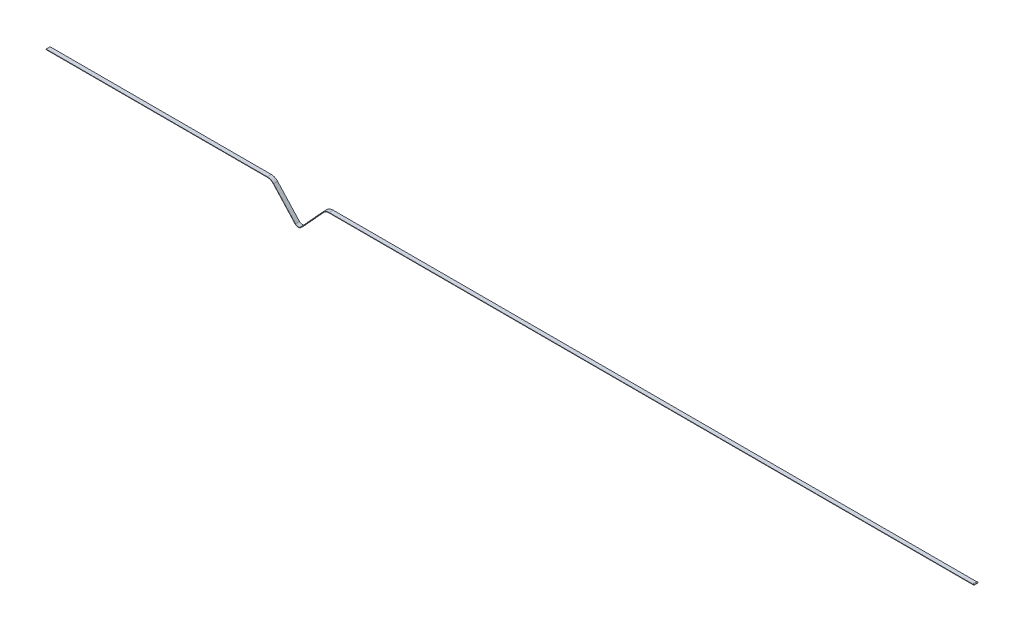
ISO-10303-21;
HEADER;
FILE_DESCRIPTION(('STEP AP214'),'2;1');
FILE_NAME('part.step','',(''),(''),'','','');
FILE_SCHEMA(('AUTOMOTIVE_DESIGN { 1 0 10303 214 1 1 1 1 }'));
ENDSEC;
DATA;
#1=APPLICATION_CONTEXT('core data for automotive mechanical design processes');
#2=APPLICATION_PROTOCOL_DEFINITION('international standard','automotive_design',2000,#1);
#3=PRODUCT_CONTEXT('',#1,'mechanical');
#4=PRODUCT('Part','Part','',(#3));
#5=PRODUCT_RELATED_PRODUCT_CATEGORY('part','',(#4));
#6=PRODUCT_DEFINITION_FORMATION('','',#4);
#7=PRODUCT_DEFINITION_CONTEXT('part definition',#1,'design');
#8=PRODUCT_DEFINITION('design','',#6,#7);
#9=PRODUCT_DEFINITION_SHAPE('','',#8);
#10=(LENGTH_UNIT() NAMED_UNIT(*) SI_UNIT(.MILLI.,.METRE.));
#11=(NAMED_UNIT(*) PLANE_ANGLE_UNIT() SI_UNIT($,.RADIAN.));
#12=(NAMED_UNIT(*) SI_UNIT($,.STERADIAN.) SOLID_ANGLE_UNIT());
#13=UNCERTAINTY_MEASURE_WITH_UNIT(LENGTH_MEASURE(1.E-05),#10,'distance_accuracy_value','');
#14=(GEOMETRIC_REPRESENTATION_CONTEXT(3) GLOBAL_UNCERTAINTY_ASSIGNED_CONTEXT((#13)) GLOBAL_UNIT_ASSIGNED_CONTEXT((#10,
#11,#12)) REPRESENTATION_CONTEXT('',''));
#15=CARTESIAN_POINT('',(0.,0.,0.));
#16=DIRECTION('',(0.,0.,1.));
#17=DIRECTION('',(1.,0.,0.));
#18=AXIS2_PLACEMENT_3D('',#15,#16,#17);
#19=CARTESIAN_POINT('',(0.,0.,0.));
#20=DIRECTION('',(-1.,0.,0.));
#21=DIRECTION('',(0.,0.,1.));
#22=AXIS2_PLACEMENT_3D('',#19,#20,#21);
#23=PLANE('',#22);
#24=DIRECTION('',(0.,-1.,0.));
#25=VECTOR('',#24,1.);
#26=CARTESIAN_POINT('',(0.,0.,0.));
#27=LINE('',#26,#25);
#28=CARTESIAN_POINT('',(0.,0.63,0.));
#29=VERTEX_POINT('',#28);
#30=CARTESIAN_POINT('',(0.,0.,0.));
#31=VERTEX_POINT('',#30);
#32=EDGE_CURVE('E247',#29,#31,#27,.T.);
#33=ORIENTED_EDGE('',*,*,#32,.T.);
#34=DIRECTION('',(0.,0.,-1.));
#35=VECTOR('',#34,1.);
#36=CARTESIAN_POINT('',(0.,0.,0.));
#37=LINE('',#36,#35);
#38=CARTESIAN_POINT('',(0.,0.,-6.));
#39=VERTEX_POINT('',#38);
#40=EDGE_CURVE('E181',#31,#39,#37,.T.);
#41=ORIENTED_EDGE('',*,*,#40,.T.);
#42=DIRECTION('',(0.,1.,0.));
#43=VECTOR('',#42,1.);
#44=CARTESIAN_POINT('',(0.,0.,-6.));
#45=LINE('',#44,#43);
#46=CARTESIAN_POINT('',(0.,0.63,-6.));
#47=VERTEX_POINT('',#46);
#48=EDGE_CURVE('E167',#39,#47,#45,.T.);
#49=ORIENTED_EDGE('',*,*,#48,.T.);
#50=DIRECTION('',(0.,0.,1.));
#51=VECTOR('',#50,1.);
#52=CARTESIAN_POINT('',(0.,0.63,0.));
#53=LINE('',#52,#51);
#54=EDGE_CURVE('E156',#47,#29,#53,.T.);
#55=ORIENTED_EDGE('',*,*,#54,.T.);
#56=EDGE_LOOP('',(#33,#41,#49,#55));
#57=FACE_BOUND('',#56,.T.);
#58=ADVANCED_FACE('F33',(#57),#23,.F.);
#59=CARTESIAN_POINT('',(-1371.6,0.,0.));
#60=DIRECTION('',(-1.,0.,0.));
#61=DIRECTION('',(0.,0.,1.));
#62=AXIS2_PLACEMENT_3D('',#59,#60,#61);
#63=PLANE('',#62);
#64=DIRECTION('',(0.,-1.,0.));
#65=VECTOR('',#64,1.);
#66=CARTESIAN_POINT('',(-1371.6,0.,0.));
#67=LINE('',#66,#65);
#68=CARTESIAN_POINT('',(-1371.6,0.629999999999958,0.));
#69=VERTEX_POINT('',#68);
#70=CARTESIAN_POINT('',(-1371.6,0.,0.));
#71=VERTEX_POINT('',#70);
#72=EDGE_CURVE('E55',#69,#71,#67,.T.);
#73=ORIENTED_EDGE('',*,*,#72,.F.);
#74=DIRECTION('',(0.,0.,1.));
#75=VECTOR('',#74,1.);
#76=CARTESIAN_POINT('',(-1371.6,0.629999999999958,0.));
#77=LINE('',#76,#75);
#78=CARTESIAN_POINT('',(-1371.6,0.629999999999958,-6.));
#79=VERTEX_POINT('',#78);
#80=EDGE_CURVE('E243',#79,#69,#77,.T.);
#81=ORIENTED_EDGE('',*,*,#80,.F.);
#82=DIRECTION('',(0.,1.,0.));
#83=VECTOR('',#82,1.);
#84=CARTESIAN_POINT('',(-1371.6,0.,-6.));
#85=LINE('',#84,#83);
#86=CARTESIAN_POINT('',(-1371.6,0.,-6.));
#87=VERTEX_POINT('',#86);
#88=EDGE_CURVE('E237',#87,#79,#85,.T.);
#89=ORIENTED_EDGE('',*,*,#88,.F.);
#90=DIRECTION('',(0.,0.,-1.));
#91=VECTOR('',#90,1.);
#92=CARTESIAN_POINT('',(-1371.6,0.,0.));
#93=LINE('',#92,#91);
#94=EDGE_CURVE('E11',#71,#87,#93,.T.);
#95=ORIENTED_EDGE('',*,*,#94,.F.);
#96=EDGE_LOOP('',(#73,#81,#89,#95));
#97=FACE_BOUND('',#96,.T.);
#98=ADVANCED_FACE('F367',(#97),#63,.T.);
#99=CARTESIAN_POINT('',(0.,0.,-6.));
#100=DIRECTION('',(0.,0.,1.));
#101=DIRECTION('',(1.,0.,0.));
#102=AXIS2_PLACEMENT_3D('',#99,#100,#101);
#103=PLANE('',#102);
#104=DIRECTION('',(-1.,0.,0.));
#105=VECTOR('',#104,1.);
#106=CARTESIAN_POINT('',(0.,0.63,-6.));
#107=LINE('',#106,#105);
#108=CARTESIAN_POINT('',(-1.5,0.63,-6.));
#109=VERTEX_POINT('',#108);
#110=CARTESIAN_POINT('',(-953.345987996192,0.629999999999884,-6.));
#111=VERTEX_POINT('',#110);
#112=EDGE_CURVE('E164',#109,#111,#107,.T.);
#113=ORIENTED_EDGE('',*,*,#112,.F.);
#114=CARTESIAN_POINT('',(-0.75,0.63,-6.));
#115=DIRECTION('',(0.,0.,1.));
#116=DIRECTION('',(1.,0.,0.));
#117=AXIS2_PLACEMENT_3D('',#114,#115,#116);
#118=CIRCLE('',#117,0.75);
#119=EDGE_CURVE('E150',#47,#109,#118,.T.);
#120=ORIENTED_EDGE('',*,*,#119,.F.);
#121=ORIENTED_EDGE('',*,*,#48,.F.);
#122=DIRECTION('',(-1.,0.,0.));
#123=VECTOR('',#122,1.);
#124=CARTESIAN_POINT('',(0.,0.,-6.));
#125=LINE('',#124,#123);
#126=CARTESIAN_POINT('',(-953.345987996192,-1.16226472890446E-13,-6.));
#127=VERTEX_POINT('',#126);
#128=EDGE_CURVE('E176',#39,#127,#125,.T.);
#129=ORIENTED_EDGE('',*,*,#128,.T.);
#130=DIRECTION('',(0.,1.,0.));
#131=VECTOR('',#130,1.);
#132=CARTESIAN_POINT('',(-953.345987996192,-1.16226472890446E-13,-6.));
#133=LINE('',#132,#131);
#134=EDGE_CURVE('E172',#127,#111,#133,.T.);
#135=ORIENTED_EDGE('',*,*,#134,.T.);
#136=EDGE_LOOP('',(#113,#120,#121,#129,#135));
#137=FACE_BOUND('',#136,.T.);
#138=ADVANCED_FACE('F170',(#137),#103,.F.);
#139=CARTESIAN_POINT('',(0.,0.63,0.));
#140=DIRECTION('',(0.,-1.,0.));
#141=DIRECTION('',(1.,0.,0.));
#142=AXIS2_PLACEMENT_3D('',#139,#140,#141);
#143=PLANE('',#142);
#144=DIRECTION('',(-1.,0.,0.));
#145=VECTOR('',#144,1.);
#146=CARTESIAN_POINT('',(0.,0.63,0.));
#147=LINE('',#146,#145);
#148=CARTESIAN_POINT('',(-1.5,0.63,0.));
#149=VERTEX_POINT('',#148);
#150=CARTESIAN_POINT('',(-953.345987996192,0.629999999999884,0.));
#151=VERTEX_POINT('',#150);
#152=EDGE_CURVE('E166',#149,#151,#147,.T.);
#153=ORIENTED_EDGE('',*,*,#152,.F.);
#154=DIRECTION('',(0.,0.,1.));
#155=VECTOR('',#154,1.);
#156=CARTESIAN_POINT('',(-1.5,0.63,-6.));
#157=LINE('',#156,#155);
#158=EDGE_CURVE('E153',#109,#149,#157,.T.);
#159=ORIENTED_EDGE('',*,*,#158,.F.);
#160=ORIENTED_EDGE('',*,*,#112,.T.);
#161=DIRECTION('',(0.,0.,1.));
#162=VECTOR('',#161,1.);
#163=CARTESIAN_POINT('',(-953.345987996192,0.629999999999884,0.));
#164=LINE('',#163,#162);
#165=EDGE_CURVE('E173',#111,#151,#164,.T.);
#166=ORIENTED_EDGE('',*,*,#165,.T.);
#167=EDGE_LOOP('',(#153,#159,#160,#166));
#168=FACE_BOUND('',#167,.T.);
#169=ADVANCED_FACE('F162',(#168),#143,.F.);
#170=CARTESIAN_POINT('',(0.,0.,0.));
#171=DIRECTION('',(0.,0.,-1.));
#172=DIRECTION('',(-1.,0.,0.));
#173=AXIS2_PLACEMENT_3D('',#170,#171,#172);
#174=PLANE('',#173);
#175=DIRECTION('',(0.,-1.,0.));
#176=VECTOR('',#175,1.);
#177=CARTESIAN_POINT('',(-953.345987996192,-1.16226472890446E-13,0.));
#178=LINE('',#177,#176);
#179=CARTESIAN_POINT('',(-953.345987996192,-1.16226472890446E-13,0.));
#180=VERTEX_POINT('',#179);
#181=EDGE_CURVE('E250',#151,#180,#178,.T.);
#182=ORIENTED_EDGE('',*,*,#181,.T.);
#183=DIRECTION('',(-1.,0.,0.));
#184=VECTOR('',#183,1.);
#185=CARTESIAN_POINT('',(0.,0.,0.));
#186=LINE('',#185,#184);
#187=EDGE_CURVE('E288',#31,#180,#186,.T.);
#188=ORIENTED_EDGE('',*,*,#187,.F.);
#189=ORIENTED_EDGE('',*,*,#32,.F.);
#190=CARTESIAN_POINT('',(-0.75,0.63,0.));
#191=DIRECTION('',(0.,0.,1.));
#192=DIRECTION('',(1.,0.,0.));
#193=AXIS2_PLACEMENT_3D('',#190,#191,#192);
#194=CIRCLE('',#193,0.75);
#195=EDGE_CURVE('E47',#29,#149,#194,.T.);
#196=ORIENTED_EDGE('',*,*,#195,.T.);
#197=ORIENTED_EDGE('',*,*,#152,.T.);
#198=EDGE_LOOP('',(#182,#188,#189,#196,#197));
#199=FACE_BOUND('',#198,.T.);
#200=ADVANCED_FACE('F415',(#199),#174,.F.);
#201=CARTESIAN_POINT('',(0.,0.,0.));
#202=DIRECTION('',(0.,1.,0.));
#203=DIRECTION('',(-1.,0.,0.));
#204=AXIS2_PLACEMENT_3D('',#201,#202,#203);
#205=PLANE('',#204);
#206=DIRECTION('',(0.,0.,-1.));
#207=VECTOR('',#206,1.);
#208=CARTESIAN_POINT('',(-953.345987996192,-1.16226472890446E-13,0.));
#209=LINE('',#208,#207);
#210=EDGE_CURVE('E192',#180,#127,#209,.T.);
#211=ORIENTED_EDGE('',*,*,#210,.T.);
#212=ORIENTED_EDGE('',*,*,#128,.F.);
#213=ORIENTED_EDGE('',*,*,#40,.F.);
#214=ORIENTED_EDGE('',*,*,#187,.T.);
#215=EDGE_LOOP('',(#211,#212,#213,#214));
#216=FACE_BOUND('',#215,.T.);
#217=ADVANCED_FACE('F408',(#216),#205,.F.);
#218=CARTESIAN_POINT('',(-953.345987996192,-1.16226472890446E-13,-6.));
#219=DIRECTION('',(0.,0.,1.));
#220=DIRECTION('',(1.,0.,0.));
#221=AXIS2_PLACEMENT_3D('',#218,#219,#220);
#222=PLANE('',#221);
#223=CARTESIAN_POINT('',(-953.345987996192,-11.9499999189761,-6.));
#224=DIRECTION('',(0.,0.,1.));
#225=DIRECTION('',(0.,1.,0.));
#226=AXIS2_PLACEMENT_3D('',#223,#224,#225);
#227=CIRCLE('',#226,12.579999918976);
#228=CARTESIAN_POINT('',(-962.629936966147,-3.46090753611742,-6.));
#229=VERTEX_POINT('',#228);
#230=EDGE_CURVE('E185',#111,#229,#227,.T.);
#231=ORIENTED_EDGE('',*,*,#230,.F.);
#232=ORIENTED_EDGE('',*,*,#134,.F.);
#233=CARTESIAN_POINT('',(-953.345987996192,-11.9499999189761,-6.));
#234=DIRECTION('',(0.,0.,1.));
#235=DIRECTION('',(0.,1.,0.));
#236=AXIS2_PLACEMENT_3D('',#233,#234,#235);
#237=CIRCLE('',#236,11.949999918976);
#238=CARTESIAN_POINT('',(-962.165001521891,-3.88603696661395,-6.));
#239=VERTEX_POINT('',#238);
#240=EDGE_CURVE('E186',#127,#239,#237,.T.);
#241=ORIENTED_EDGE('',*,*,#240,.T.);
#242=DIRECTION('',(-0.737992768660573,0.674808619835803,0.));
#243=VECTOR('',#242,1.);
#244=CARTESIAN_POINT('',(-962.165001521891,-3.88603696661395,-6.));
#245=LINE('',#244,#243);
#246=EDGE_CURVE('E182',#239,#229,#245,.T.);
#247=ORIENTED_EDGE('',*,*,#246,.T.);
#248=EDGE_LOOP('',(#231,#232,#241,#247));
#249=FACE_BOUND('',#248,.T.);
#250=ADVANCED_FACE('F406',(#249),#222,.F.);
#251=CARTESIAN_POINT('',(-953.345987996192,-11.9499999189761,0.));
#252=DIRECTION('',(0.,0.,1.));
#253=DIRECTION('',(1.,0.,0.));
#254=AXIS2_PLACEMENT_3D('',#251,#252,#253);
#255=CYLINDRICAL_SURFACE('',#254,12.579999918976);
#256=CARTESIAN_POINT('',(-953.345987996192,-11.9499999189761,0.));
#257=DIRECTION('',(0.,0.,1.));
#258=DIRECTION('',(0.,1.,0.));
#259=AXIS2_PLACEMENT_3D('',#256,#257,#258);
#260=CIRCLE('',#259,12.579999918976);
#261=CARTESIAN_POINT('',(-962.629936966147,-3.46090753611742,0.));
#262=VERTEX_POINT('',#261);
#263=EDGE_CURVE('E253',#151,#262,#260,.T.);
#264=ORIENTED_EDGE('',*,*,#263,.F.);
#265=ORIENTED_EDGE('',*,*,#165,.F.);
#266=ORIENTED_EDGE('',*,*,#230,.T.);
#267=DIRECTION('',(0.,0.,1.));
#268=VECTOR('',#267,1.);
#269=CARTESIAN_POINT('',(-962.629936966147,-3.46090753611739,0.));
#270=LINE('',#269,#268);
#271=EDGE_CURVE('E189',#229,#262,#270,.T.);
#272=ORIENTED_EDGE('',*,*,#271,.T.);
#273=EDGE_LOOP('',(#264,#265,#266,#272));
#274=FACE_BOUND('',#273,.T.);
#275=ADVANCED_FACE('F404',(#274),#255,.T.);
#276=CARTESIAN_POINT('',(-953.345987996192,-1.16226472890446E-13,0.));
#277=DIRECTION('',(0.,0.,-1.));
#278=DIRECTION('',(-1.,0.,0.));
#279=AXIS2_PLACEMENT_3D('',#276,#277,#278);
#280=PLANE('',#279);
#281=CARTESIAN_POINT('',(-953.345987996192,-11.9499999189761,0.));
#282=DIRECTION('',(0.,0.,1.));
#283=DIRECTION('',(0.,1.,0.));
#284=AXIS2_PLACEMENT_3D('',#281,#282,#283);
#285=CIRCLE('',#284,11.949999918976);
#286=CARTESIAN_POINT('',(-962.165001521891,-3.88603696661395,0.));
#287=VERTEX_POINT('',#286);
#288=EDGE_CURVE('E292',#180,#287,#285,.T.);
#289=ORIENTED_EDGE('',*,*,#288,.F.);
#290=ORIENTED_EDGE('',*,*,#181,.F.);
#291=ORIENTED_EDGE('',*,*,#263,.T.);
#292=DIRECTION('',(0.737992768660573,-0.674808619835803,0.));
#293=VECTOR('',#292,1.);
#294=CARTESIAN_POINT('',(-962.165001521891,-3.88603696661395,0.));
#295=LINE('',#294,#293);
#296=EDGE_CURVE('E256',#262,#287,#295,.T.);
#297=ORIENTED_EDGE('',*,*,#296,.T.);
#298=EDGE_LOOP('',(#289,#290,#291,#297));
#299=FACE_BOUND('',#298,.T.);
#300=ADVANCED_FACE('F395',(#299),#280,.F.);
#301=CARTESIAN_POINT('',(-953.345987996192,-11.9499999189761,0.));
#302=DIRECTION('',(0.,0.,1.));
#303=DIRECTION('',(1.,0.,0.));
#304=AXIS2_PLACEMENT_3D('',#301,#302,#303);
#305=CYLINDRICAL_SURFACE('',#304,11.949999918976);
#306=DIRECTION('',(0.,0.,-1.));
#307=VECTOR('',#306,1.);
#308=CARTESIAN_POINT('',(-962.165001521891,-3.88603696661395,0.));
#309=LINE('',#308,#307);
#310=EDGE_CURVE('E203',#287,#239,#309,.T.);
#311=ORIENTED_EDGE('',*,*,#310,.T.);
#312=ORIENTED_EDGE('',*,*,#240,.F.);
#313=ORIENTED_EDGE('',*,*,#210,.F.);
#314=ORIENTED_EDGE('',*,*,#288,.T.);
#315=EDGE_LOOP('',(#311,#312,#313,#314));
#316=FACE_BOUND('',#315,.T.);
#317=ADVANCED_FACE('F389',(#316),#305,.F.);
#318=CARTESIAN_POINT('',(-962.165001521891,-3.88603696661395,-6.));
#319=DIRECTION('',(0.,0.,1.));
#320=DIRECTION('',(1.,0.,0.));
#321=AXIS2_PLACEMENT_3D('',#318,#319,#320);
#322=PLANE('',#321);
#323=DIRECTION('',(-0.674808619835802,-0.737992768660574,0.));
#324=VECTOR('',#323,1.);
#325=CARTESIAN_POINT('',(-962.629936966147,-3.4609075361174,-6.));
#326=LINE('',#325,#324);
#327=CARTESIAN_POINT('',(-994.871787623935,-38.7216495217064,-6.));
#328=VERTEX_POINT('',#327);
#329=EDGE_CURVE('E196',#229,#328,#326,.T.);
#330=ORIENTED_EDGE('',*,*,#329,.F.);
#331=ORIENTED_EDGE('',*,*,#246,.F.);
#332=DIRECTION('',(-0.674808619835802,-0.737992768660574,0.));
#333=VECTOR('',#332,1.);
#334=CARTESIAN_POINT('',(-962.165001521891,-3.88603696661395,-6.));
#335=LINE('',#334,#333);
#336=CARTESIAN_POINT('',(-994.406852179679,-39.1467789522029,-6.));
#337=VERTEX_POINT('',#336);
#338=EDGE_CURVE('E197',#239,#337,#335,.T.);
#339=ORIENTED_EDGE('',*,*,#338,.T.);
#340=DIRECTION('',(-0.737992768660574,0.674808619835802,0.));
#341=VECTOR('',#340,1.);
#342=CARTESIAN_POINT('',(-994.406852179679,-39.1467789522029,-6.));
#343=LINE('',#342,#341);
#344=EDGE_CURVE('E193',#337,#328,#343,.T.);
#345=ORIENTED_EDGE('',*,*,#344,.T.);
#346=EDGE_LOOP('',(#330,#331,#339,#345));
#347=FACE_BOUND('',#346,.T.);
#348=ADVANCED_FACE('F383',(#347),#322,.F.);
#349=CARTESIAN_POINT('',(-962.629936966147,-3.4609075361174,0.));
#350=DIRECTION('',(0.737992768660574,-0.674808619835802,0.));
#351=DIRECTION('',(0.674808619835802,0.737992768660574,0.));
#352=AXIS2_PLACEMENT_3D('',#349,#350,#351);
#353=PLANE('',#352);
#354=DIRECTION('',(-0.674808619835802,-0.737992768660574,0.));
#355=VECTOR('',#354,1.);
#356=CARTESIAN_POINT('',(-962.629936966147,-3.4609075361174,0.));
#357=LINE('',#356,#355);
#358=CARTESIAN_POINT('',(-994.871787623935,-38.7216495217064,0.));
#359=VERTEX_POINT('',#358);
#360=EDGE_CURVE('E259',#262,#359,#357,.T.);
#361=ORIENTED_EDGE('',*,*,#360,.F.);
#362=ORIENTED_EDGE('',*,*,#271,.F.);
#363=ORIENTED_EDGE('',*,*,#329,.T.);
#364=DIRECTION('',(0.,0.,1.));
#365=VECTOR('',#364,1.);
#366=CARTESIAN_POINT('',(-994.871787623935,-38.7216495217064,0.));
#367=LINE('',#366,#365);
#368=EDGE_CURVE('E200',#328,#359,#367,.T.);
#369=ORIENTED_EDGE('',*,*,#368,.T.);
#370=EDGE_LOOP('',(#361,#362,#363,#369));
#371=FACE_BOUND('',#370,.T.);
#372=ADVANCED_FACE('F401',(#371),#353,.F.);
#373=CARTESIAN_POINT('',(-962.165001521891,-3.88603696661395,0.));
#374=DIRECTION('',(0.,0.,-1.));
#375=DIRECTION('',(-1.,0.,0.));
#376=AXIS2_PLACEMENT_3D('',#373,#374,#375);
#377=PLANE('',#376);
#378=DIRECTION('',(-0.674808619835802,-0.737992768660574,0.));
#379=VECTOR('',#378,1.);
#380=CARTESIAN_POINT('',(-962.165001521891,-3.88603696661395,0.));
#381=LINE('',#380,#379);
#382=CARTESIAN_POINT('',(-994.406852179679,-39.1467789522029,0.));
#383=VERTEX_POINT('',#382);
#384=EDGE_CURVE('E297',#287,#383,#381,.T.);
#385=ORIENTED_EDGE('',*,*,#384,.F.);
#386=ORIENTED_EDGE('',*,*,#296,.F.);
#387=ORIENTED_EDGE('',*,*,#360,.T.);
#388=DIRECTION('',(0.737992768660574,-0.674808619835802,0.));
#389=VECTOR('',#388,1.);
#390=CARTESIAN_POINT('',(-994.406852179679,-39.1467789522029,0.));
#391=LINE('',#390,#389);
#392=EDGE_CURVE('E262',#359,#383,#391,.T.);
#393=ORIENTED_EDGE('',*,*,#392,.T.);
#394=EDGE_LOOP('',(#385,#386,#387,#393));
#395=FACE_BOUND('',#394,.T.);
#396=ADVANCED_FACE('F398',(#395),#377,.F.);
#397=CARTESIAN_POINT('',(-962.165001521891,-3.88603696661395,0.));
#398=DIRECTION('',(-0.737992768660574,0.674808619835802,0.));
#399=DIRECTION('',(-0.674808619835802,-0.737992768660574,0.));
#400=AXIS2_PLACEMENT_3D('',#397,#398,#399);
#401=PLANE('',#400);
#402=DIRECTION('',(0.,0.,-1.));
#403=VECTOR('',#402,1.);
#404=CARTESIAN_POINT('',(-994.406852179679,-39.1467789522029,0.));
#405=LINE('',#404,#403);
#406=EDGE_CURVE('E214',#383,#337,#405,.T.);
#407=ORIENTED_EDGE('',*,*,#406,.T.);
#408=ORIENTED_EDGE('',*,*,#338,.F.);
#409=ORIENTED_EDGE('',*,*,#310,.F.);
#410=ORIENTED_EDGE('',*,*,#384,.T.);
#411=EDGE_LOOP('',(#407,#408,#409,#410));
#412=FACE_BOUND('',#411,.T.);
#413=ADVANCED_FACE('F386',(#412),#401,.F.);
#414=CARTESIAN_POINT('',(-994.406852179679,-39.146778952203,-6.));
#415=DIRECTION('',(0.,0.,1.));
#416=DIRECTION('',(1.,0.,0.));
#417=AXIS2_PLACEMENT_3D('',#414,#415,#416);
#418=PLANE('',#417);
#419=CARTESIAN_POINT('',(-998.915987996195,-35.0236982850061,-6.));
#420=DIRECTION('',(0.,0.,-1.));
#421=DIRECTION('',(0.73799276866057,-0.674808619835807,0.));
#422=AXIS2_PLACEMENT_3D('',#419,#420,#421);
#423=CIRCLE('',#422,5.48000000000003);
#424=CARTESIAN_POINT('',(-1002.9601883705,-38.721649519475,-6.));
#425=VERTEX_POINT('',#424);
#426=EDGE_CURVE('E207',#328,#425,#423,.T.);
#427=ORIENTED_EDGE('',*,*,#426,.F.);
#428=ORIENTED_EDGE('',*,*,#344,.F.);
#429=CARTESIAN_POINT('',(-998.915987996195,-35.0236982850061,-6.));
#430=DIRECTION('',(0.,0.,-1.));
#431=DIRECTION('',(0.737992768660572,-0.674808619835805,0.));
#432=AXIS2_PLACEMENT_3D('',#429,#430,#431);
#433=CIRCLE('',#432,6.11000000000005);
#434=CARTESIAN_POINT('',(-1003.42512381499,-39.146778949715,-6.));
#435=VERTEX_POINT('',#434);
#436=EDGE_CURVE('E208',#337,#435,#433,.T.);
#437=ORIENTED_EDGE('',*,*,#436,.T.);
#438=DIRECTION('',(0.737992769032901,0.674808619428614,0.));
#439=VECTOR('',#438,1.);
#440=CARTESIAN_POINT('',(-1003.42512381499,-39.146778949715,-6.));
#441=LINE('',#440,#439);
#442=EDGE_CURVE('E204',#435,#425,#441,.T.);
#443=ORIENTED_EDGE('',*,*,#442,.T.);
#444=EDGE_LOOP('',(#427,#428,#437,#443));
#445=FACE_BOUND('',#444,.T.);
#446=ADVANCED_FACE('F380',(#445),#418,.F.);
#447=CARTESIAN_POINT('',(-998.915987996195,-35.0236982850061,0.));
#448=DIRECTION('',(0.,0.,-1.));
#449=DIRECTION('',(-1.,0.,0.));
#450=AXIS2_PLACEMENT_3D('',#447,#448,#449);
#451=CYLINDRICAL_SURFACE('',#450,5.48000000000003);
#452=CARTESIAN_POINT('',(-998.915987996195,-35.0236982850061,0.));
#453=DIRECTION('',(0.,0.,-1.));
#454=DIRECTION('',(0.73799276866057,-0.674808619835807,0.));
#455=AXIS2_PLACEMENT_3D('',#452,#453,#454);
#456=CIRCLE('',#455,5.48000000000003);
#457=CARTESIAN_POINT('',(-1002.9601883705,-38.721649519475,0.));
#458=VERTEX_POINT('',#457);
#459=EDGE_CURVE('E265',#359,#458,#456,.T.);
#460=ORIENTED_EDGE('',*,*,#459,.F.);
#461=ORIENTED_EDGE('',*,*,#368,.F.);
#462=ORIENTED_EDGE('',*,*,#426,.T.);
#463=DIRECTION('',(0.,0.,1.));
#464=VECTOR('',#463,1.);
#465=CARTESIAN_POINT('',(-1002.9601883705,-38.721649519475,0.));
#466=LINE('',#465,#464);
#467=EDGE_CURVE('E211',#425,#458,#466,.T.);
#468=ORIENTED_EDGE('',*,*,#467,.T.);
#469=EDGE_LOOP('',(#460,#461,#462,#468));
#470=FACE_BOUND('',#469,.T.);
#471=ADVANCED_FACE('F377',(#470),#451,.F.);
#472=CARTESIAN_POINT('',(-994.406852179679,-39.146778952203,0.));
#473=DIRECTION('',(0.,0.,-1.));
#474=DIRECTION('',(-1.,0.,0.));
#475=AXIS2_PLACEMENT_3D('',#472,#473,#474);
#476=PLANE('',#475);
#477=CARTESIAN_POINT('',(-998.915987996195,-35.0236982850061,0.));
#478=DIRECTION('',(0.,0.,-1.));
#479=DIRECTION('',(0.737992768660572,-0.674808619835805,0.));
#480=AXIS2_PLACEMENT_3D('',#477,#478,#479);
#481=CIRCLE('',#480,6.11000000000005);
#482=CARTESIAN_POINT('',(-1003.42512381499,-39.146778949715,0.));
#483=VERTEX_POINT('',#482);
#484=EDGE_CURVE('E302',#383,#483,#481,.T.);
#485=ORIENTED_EDGE('',*,*,#484,.F.);
#486=ORIENTED_EDGE('',*,*,#392,.F.);
#487=ORIENTED_EDGE('',*,*,#459,.T.);
#488=DIRECTION('',(-0.737992769032901,-0.674808619428614,0.));
#489=VECTOR('',#488,1.);
#490=CARTESIAN_POINT('',(-1003.42512381499,-39.146778949715,0.));
#491=LINE('',#490,#489);
#492=EDGE_CURVE('E268',#458,#483,#491,.T.);
#493=ORIENTED_EDGE('',*,*,#492,.T.);
#494=EDGE_LOOP('',(#485,#486,#487,#493));
#495=FACE_BOUND('',#494,.T.);
#496=ADVANCED_FACE('F355',(#495),#476,.F.);
#497=CARTESIAN_POINT('',(-998.915987996195,-35.0236982850061,0.));
#498=DIRECTION('',(0.,0.,-1.));
#499=DIRECTION('',(-1.,0.,0.));
#500=AXIS2_PLACEMENT_3D('',#497,#498,#499);
#501=CYLINDRICAL_SURFACE('',#500,6.11000000000005);
#502=DIRECTION('',(0.,0.,-1.));
#503=VECTOR('',#502,1.);
#504=CARTESIAN_POINT('',(-1003.42512381499,-39.146778949715,0.));
#505=LINE('',#504,#503);
#506=EDGE_CURVE('E225',#483,#435,#505,.T.);
#507=ORIENTED_EDGE('',*,*,#506,.T.);
#508=ORIENTED_EDGE('',*,*,#436,.F.);
#509=ORIENTED_EDGE('',*,*,#406,.F.);
#510=ORIENTED_EDGE('',*,*,#484,.T.);
#511=EDGE_LOOP('',(#507,#508,#509,#510));
#512=FACE_BOUND('',#511,.T.);
#513=ADVANCED_FACE('F350',(#512),#501,.T.);
#514=CARTESIAN_POINT('',(-1003.42512381499,-39.1467789497151,-6.));
#515=DIRECTION('',(0.,0.,1.));
#516=DIRECTION('',(1.,0.,0.));
#517=AXIS2_PLACEMENT_3D('',#514,#515,#516);
#518=PLANE('',#517);
#519=DIRECTION('',(-0.674808619428608,0.737992769032906,0.));
#520=VECTOR('',#519,1.);
#521=CARTESIAN_POINT('',(-1002.9601883705,-38.7216495194751,-6.));
#522=LINE('',#521,#520);
#523=CARTESIAN_POINT('',(-1035.20203896174,-3.46090756759836,-6.));
#524=VERTEX_POINT('',#523);
#525=EDGE_CURVE('E218',#425,#524,#522,.T.);
#526=ORIENTED_EDGE('',*,*,#525,.F.);
#527=ORIENTED_EDGE('',*,*,#442,.F.);
#528=DIRECTION('',(-0.674808619428608,0.737992769032906,0.));
#529=VECTOR('',#528,1.);
#530=CARTESIAN_POINT('',(-1003.42512381499,-39.1467789497151,-6.));
#531=LINE('',#530,#529);
#532=CARTESIAN_POINT('',(-1035.66697440623,-3.88603699783838,-6.));
#533=VERTEX_POINT('',#532);
#534=EDGE_CURVE('E219',#435,#533,#531,.T.);
#535=ORIENTED_EDGE('',*,*,#534,.T.);
#536=DIRECTION('',(0.737992769032906,0.674808619428608,0.));
#537=VECTOR('',#536,1.);
#538=CARTESIAN_POINT('',(-1035.66697440623,-3.88603699783839,-6.));
#539=LINE('',#538,#537);
#540=EDGE_CURVE('E215',#533,#524,#539,.T.);
#541=ORIENTED_EDGE('',*,*,#540,.T.);
#542=EDGE_LOOP('',(#526,#527,#535,#541));
#543=FACE_BOUND('',#542,.T.);
#544=ADVANCED_FACE('F345',(#543),#518,.F.);
#545=CARTESIAN_POINT('',(-1002.9601883705,-38.7216495194751,0.));
#546=DIRECTION('',(-0.737992769032906,-0.674808619428608,0.));
#547=DIRECTION('',(0.674808619428608,-0.737992769032906,0.));
#548=AXIS2_PLACEMENT_3D('',#545,#546,#547);
#549=PLANE('',#548);
#550=DIRECTION('',(-0.674808619428608,0.737992769032906,0.));
#551=VECTOR('',#550,1.);
#552=CARTESIAN_POINT('',(-1002.9601883705,-38.7216495194751,0.));
#553=LINE('',#552,#551);
#554=CARTESIAN_POINT('',(-1035.20203896174,-3.46090756759836,0.));
#555=VERTEX_POINT('',#554);
#556=EDGE_CURVE('E271',#458,#555,#553,.T.);
#557=ORIENTED_EDGE('',*,*,#556,.F.);
#558=ORIENTED_EDGE('',*,*,#467,.F.);
#559=ORIENTED_EDGE('',*,*,#525,.T.);
#560=DIRECTION('',(0.,0.,1.));
#561=VECTOR('',#560,1.);
#562=CARTESIAN_POINT('',(-1035.20203896174,-3.46090756759837,0.));
#563=LINE('',#562,#561);
#564=EDGE_CURVE('E222',#524,#555,#563,.T.);
#565=ORIENTED_EDGE('',*,*,#564,.T.);
#566=EDGE_LOOP('',(#557,#558,#559,#565));
#567=FACE_BOUND('',#566,.T.);
#568=ADVANCED_FACE('F374',(#567),#549,.F.);
#569=CARTESIAN_POINT('',(-1003.42512381499,-39.1467789497151,0.));
#570=DIRECTION('',(0.,0.,-1.));
#571=DIRECTION('',(-1.,0.,0.));
#572=AXIS2_PLACEMENT_3D('',#569,#570,#571);
#573=PLANE('',#572);
#574=DIRECTION('',(-0.674808619428608,0.737992769032906,0.));
#575=VECTOR('',#574,1.);
#576=CARTESIAN_POINT('',(-1003.42512381499,-39.1467789497151,0.));
#577=LINE('',#576,#575);
#578=CARTESIAN_POINT('',(-1035.66697440623,-3.88603699783838,0.));
#579=VERTEX_POINT('',#578);
#580=EDGE_CURVE('E307',#483,#579,#577,.T.);
#581=ORIENTED_EDGE('',*,*,#580,.F.);
#582=ORIENTED_EDGE('',*,*,#492,.F.);
#583=ORIENTED_EDGE('',*,*,#556,.T.);
#584=DIRECTION('',(-0.737992769032906,-0.674808619428608,0.));
#585=VECTOR('',#584,1.);
#586=CARTESIAN_POINT('',(-1035.66697440623,-3.88603699783839,0.));
#587=LINE('',#586,#585);
#588=EDGE_CURVE('E274',#555,#579,#587,.T.);
#589=ORIENTED_EDGE('',*,*,#588,.T.);
#590=EDGE_LOOP('',(#581,#582,#583,#589));
#591=FACE_BOUND('',#590,.T.);
#592=ADVANCED_FACE('F357',(#591),#573,.F.);
#593=CARTESIAN_POINT('',(-1003.42512381499,-39.1467789497151,0.));
#594=DIRECTION('',(0.737992769032906,0.674808619428608,0.));
#595=DIRECTION('',(-0.674808619428608,0.737992769032906,0.));
#596=AXIS2_PLACEMENT_3D('',#593,#594,#595);
#597=PLANE('',#596);
#598=DIRECTION('',(0.,0.,-1.));
#599=VECTOR('',#598,1.);
#600=CARTESIAN_POINT('',(-1035.66697440623,-3.88603699783839,0.));
#601=LINE('',#600,#599);
#602=EDGE_CURVE('E236',#579,#533,#601,.T.);
#603=ORIENTED_EDGE('',*,*,#602,.T.);
#604=ORIENTED_EDGE('',*,*,#534,.F.);
#605=ORIENTED_EDGE('',*,*,#506,.F.);
#606=ORIENTED_EDGE('',*,*,#580,.T.);
#607=EDGE_LOOP('',(#603,#604,#605,#606));
#608=FACE_BOUND('',#607,.T.);
#609=ADVANCED_FACE('F348',(#608),#597,.F.);
#610=CARTESIAN_POINT('',(-1035.66697440623,-3.88603699783845,-6.));
#611=DIRECTION('',(0.,0.,1.));
#612=DIRECTION('',(1.,0.,0.));
#613=AXIS2_PLACEMENT_3D('',#610,#611,#612);
#614=PLANE('',#613);
#615=CARTESIAN_POINT('',(-1044.48598799619,-11.9500000000317,-6.));
#616=DIRECTION('',(0.,0.,1.));
#617=DIRECTION('',(0.737992769032909,0.674808619428605,0.));
#618=AXIS2_PLACEMENT_3D('',#615,#616,#617);
#619=CIRCLE('',#618,12.5800000000317);
#620=CARTESIAN_POINT('',(-1044.48598799619,0.630000000000039,-6.));
#621=VERTEX_POINT('',#620);
#622=EDGE_CURVE('E229',#524,#621,#619,.T.);
#623=ORIENTED_EDGE('',*,*,#622,.F.);
#624=ORIENTED_EDGE('',*,*,#540,.F.);
#625=CARTESIAN_POINT('',(-1044.48598799619,-11.9500000000317,-6.));
#626=DIRECTION('',(0.,0.,1.));
#627=DIRECTION('',(0.737992769032907,0.674808619428607,0.));
#628=AXIS2_PLACEMENT_3D('',#625,#626,#627);
#629=CIRCLE('',#628,11.9500000000317);
#630=CARTESIAN_POINT('',(-1044.48598799619,0.,-6.));
#631=VERTEX_POINT('',#630);
#632=EDGE_CURVE('E230',#533,#631,#629,.T.);
#633=ORIENTED_EDGE('',*,*,#632,.T.);
#634=DIRECTION('',(0.,1.,0.));
#635=VECTOR('',#634,1.);
#636=CARTESIAN_POINT('',(-1044.48598799619,0.,-6.));
#637=LINE('',#636,#635);
#638=EDGE_CURVE('E226',#631,#621,#637,.T.);
#639=ORIENTED_EDGE('',*,*,#638,.T.);
#640=EDGE_LOOP('',(#623,#624,#633,#639));
#641=FACE_BOUND('',#640,.T.);
#642=ADVANCED_FACE('F341',(#641),#614,.F.);
#643=CARTESIAN_POINT('',(-1044.48598799619,-11.9500000000317,0.));
#644=DIRECTION('',(0.,0.,1.));
#645=DIRECTION('',(1.,0.,0.));
#646=AXIS2_PLACEMENT_3D('',#643,#644,#645);
#647=CYLINDRICAL_SURFACE('',#646,12.5800000000317);
#648=CARTESIAN_POINT('',(-1044.48598799619,-11.9500000000317,0.));
#649=DIRECTION('',(0.,0.,1.));
#650=DIRECTION('',(0.737992769032909,0.674808619428605,0.));
#651=AXIS2_PLACEMENT_3D('',#648,#649,#650);
#652=CIRCLE('',#651,12.5800000000317);
#653=CARTESIAN_POINT('',(-1044.48598799619,0.630000000000039,0.));
#654=VERTEX_POINT('',#653);
#655=EDGE_CURVE('E277',#555,#654,#652,.T.);
#656=ORIENTED_EDGE('',*,*,#655,.F.);
#657=ORIENTED_EDGE('',*,*,#564,.F.);
#658=ORIENTED_EDGE('',*,*,#622,.T.);
#659=DIRECTION('',(0.,0.,1.));
#660=VECTOR('',#659,1.);
#661=CARTESIAN_POINT('',(-1044.48598799619,0.629999999999957,0.));
#662=LINE('',#661,#660);
#663=EDGE_CURVE('E233',#621,#654,#662,.T.);
#664=ORIENTED_EDGE('',*,*,#663,.T.);
#665=EDGE_LOOP('',(#656,#657,#658,#664));
#666=FACE_BOUND('',#665,.T.);
#667=ADVANCED_FACE('F371',(#666),#647,.T.);
#668=CARTESIAN_POINT('',(-1035.66697440623,-3.88603699783845,0.));
#669=DIRECTION('',(0.,0.,-1.));
#670=DIRECTION('',(-1.,0.,0.));
#671=AXIS2_PLACEMENT_3D('',#668,#669,#670);
#672=PLANE('',#671);
#673=CARTESIAN_POINT('',(-1044.48598799619,-11.9500000000317,0.));
#674=DIRECTION('',(0.,0.,1.));
#675=DIRECTION('',(0.737992769032907,0.674808619428607,0.));
#676=AXIS2_PLACEMENT_3D('',#673,#674,#675);
#677=CIRCLE('',#676,11.9500000000317);
#678=CARTESIAN_POINT('',(-1044.48598799619,0.,0.));
#679=VERTEX_POINT('',#678);
#680=EDGE_CURVE('E312',#579,#679,#677,.T.);
#681=ORIENTED_EDGE('',*,*,#680,.F.);
#682=ORIENTED_EDGE('',*,*,#588,.F.);
#683=ORIENTED_EDGE('',*,*,#655,.T.);
#684=DIRECTION('',(0.,-1.,0.));
#685=VECTOR('',#684,1.);
#686=CARTESIAN_POINT('',(-1044.48598799619,0.,0.));
#687=LINE('',#686,#685);
#688=EDGE_CURVE('E280',#654,#679,#687,.T.);
#689=ORIENTED_EDGE('',*,*,#688,.T.);
#690=EDGE_LOOP('',(#681,#682,#683,#689));
#691=FACE_BOUND('',#690,.T.);
#692=ADVANCED_FACE('F360',(#691),#672,.F.);
#693=CARTESIAN_POINT('',(-1044.48598799619,-11.9500000000317,0.));
#694=DIRECTION('',(0.,0.,1.));
#695=DIRECTION('',(1.,0.,0.));
#696=AXIS2_PLACEMENT_3D('',#693,#694,#695);
#697=CYLINDRICAL_SURFACE('',#696,11.9500000000317);
#698=DIRECTION('',(0.,0.,-1.));
#699=VECTOR('',#698,1.);
#700=CARTESIAN_POINT('',(-1044.48598799619,0.,0.));
#701=LINE('',#700,#699);
#702=EDGE_CURVE('E246',#679,#631,#701,.T.);
#703=ORIENTED_EDGE('',*,*,#702,.T.);
#704=ORIENTED_EDGE('',*,*,#632,.F.);
#705=ORIENTED_EDGE('',*,*,#602,.F.);
#706=ORIENTED_EDGE('',*,*,#680,.T.);
#707=EDGE_LOOP('',(#703,#704,#705,#706));
#708=FACE_BOUND('',#707,.T.);
#709=ADVANCED_FACE('F333',(#708),#697,.F.);
#710=CARTESIAN_POINT('',(-1044.48598799619,-1.26634813746307E-13,-6.));
#711=DIRECTION('',(0.,0.,1.));
#712=DIRECTION('',(1.,0.,0.));
#713=AXIS2_PLACEMENT_3D('',#710,#711,#712);
#714=PLANE('',#713);
#715=DIRECTION('',(-1.,0.,0.));
#716=VECTOR('',#715,1.);
#717=CARTESIAN_POINT('',(-1044.48598799619,0.629999999999873,-6.));
#718=LINE('',#717,#716);
#719=EDGE_CURVE('E239',#621,#79,#718,.T.);
#720=ORIENTED_EDGE('',*,*,#719,.F.);
#721=ORIENTED_EDGE('',*,*,#638,.F.);
#722=DIRECTION('',(-1.,0.,0.));
#723=VECTOR('',#722,1.);
#724=CARTESIAN_POINT('',(-1044.48598799619,-1.26634813746307E-13,-6.));
#725=LINE('',#724,#723);
#726=EDGE_CURVE('E240',#631,#87,#725,.T.);
#727=ORIENTED_EDGE('',*,*,#726,.T.);
#728=ORIENTED_EDGE('',*,*,#88,.T.);
#729=EDGE_LOOP('',(#720,#721,#727,#728));
#730=FACE_BOUND('',#729,.T.);
#731=ADVANCED_FACE('F337',(#730),#714,.F.);
#732=CARTESIAN_POINT('',(-1044.48598799619,0.629999999999873,0.));
#733=DIRECTION('',(0.,-1.,0.));
#734=DIRECTION('',(1.,0.,0.));
#735=AXIS2_PLACEMENT_3D('',#732,#733,#734);
#736=PLANE('',#735);
#737=DIRECTION('',(-1.,0.,0.));
#738=VECTOR('',#737,1.);
#739=CARTESIAN_POINT('',(-1044.48598799619,0.629999999999873,0.));
#740=LINE('',#739,#738);
#741=EDGE_CURVE('E282',#654,#69,#740,.T.);
#742=ORIENTED_EDGE('',*,*,#741,.F.);
#743=ORIENTED_EDGE('',*,*,#663,.F.);
#744=ORIENTED_EDGE('',*,*,#719,.T.);
#745=ORIENTED_EDGE('',*,*,#80,.T.);
#746=EDGE_LOOP('',(#742,#743,#744,#745));
#747=FACE_BOUND('',#746,.T.);
#748=ADVANCED_FACE('F369',(#747),#736,.F.);
#749=CARTESIAN_POINT('',(-1044.48598799619,-1.26634813746307E-13,0.));
#750=DIRECTION('',(0.,0.,-1.));
#751=DIRECTION('',(-1.,0.,0.));
#752=AXIS2_PLACEMENT_3D('',#749,#750,#751);
#753=PLANE('',#752);
#754=DIRECTION('',(-1.,0.,0.));
#755=VECTOR('',#754,1.);
#756=CARTESIAN_POINT('',(-1044.48598799619,-1.26634813746307E-13,0.));
#757=LINE('',#756,#755);
#758=EDGE_CURVE('E40',#679,#71,#757,.T.);
#759=ORIENTED_EDGE('',*,*,#758,.F.);
#760=ORIENTED_EDGE('',*,*,#688,.F.);
#761=ORIENTED_EDGE('',*,*,#741,.T.);
#762=ORIENTED_EDGE('',*,*,#72,.T.);
#763=EDGE_LOOP('',(#759,#760,#761,#762));
#764=FACE_BOUND('',#763,.T.);
#765=ADVANCED_FACE('F362',(#764),#753,.F.);
#766=CARTESIAN_POINT('',(-1044.48598799619,-1.26634813746307E-13,0.));
#767=DIRECTION('',(0.,1.,0.));
#768=DIRECTION('',(-1.,0.,0.));
#769=AXIS2_PLACEMENT_3D('',#766,#767,#768);
#770=PLANE('',#769);
#771=ORIENTED_EDGE('',*,*,#94,.T.);
#772=ORIENTED_EDGE('',*,*,#726,.F.);
#773=ORIENTED_EDGE('',*,*,#702,.F.);
#774=ORIENTED_EDGE('',*,*,#758,.T.);
#775=EDGE_LOOP('',(#771,#772,#773,#774));
#776=FACE_BOUND('',#775,.T.);
#777=ADVANCED_FACE('F363',(#776),#770,.F.);
#778=CARTESIAN_POINT('',(-0.75,0.63,-6.));
#779=DIRECTION('',(0.,0.,1.));
#780=DIRECTION('',(1.,0.,0.));
#781=AXIS2_PLACEMENT_3D('',#778,#779,#780);
#782=CYLINDRICAL_SURFACE('',#781,0.75);
#783=ORIENTED_EDGE('',*,*,#195,.F.);
#784=ORIENTED_EDGE('',*,*,#54,.F.);
#785=ORIENTED_EDGE('',*,*,#119,.T.);
#786=ORIENTED_EDGE('',*,*,#158,.T.);
#787=EDGE_LOOP('',(#783,#784,#785,#786));
#788=FACE_BOUND('',#787,.T.);
#789=ADVANCED_FACE('F152',(#788),#782,.T.);
#790=CLOSED_SHELL('',(#58,#98,#138,#169,#200,#217,#250,#275,#300,#317,#348,#372,#396,#413,#446,
#471,#496,#513,#544,#568,#592,#609,#642,#667,#692,#709,#731,#748,#765,#777,#789));
#791=MANIFOLD_SOLID_BREP('B2',#790);
#792=ADVANCED_BREP_SHAPE_REPRESENTATION('',(#18,#791),#14);
#793=SHAPE_DEFINITION_REPRESENTATION(#9,#792);
ENDSEC;
END-ISO-10303-21;
